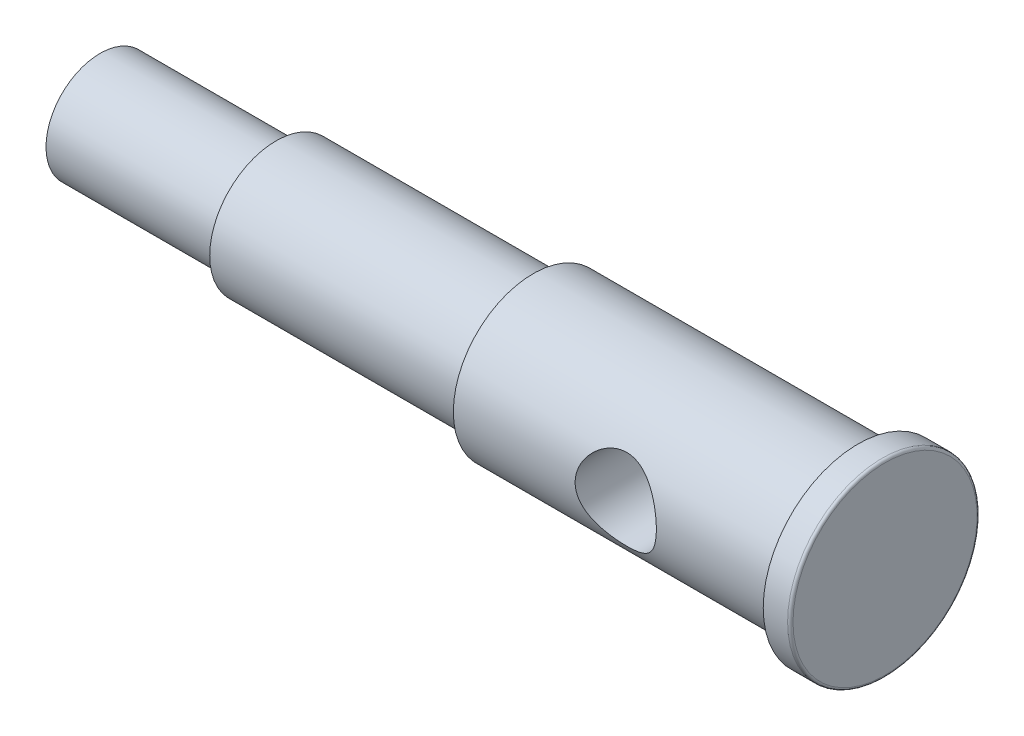
ISO-10303-21;
HEADER;
FILE_DESCRIPTION(('STEP AP214'),'2;1');
FILE_NAME('part.step','',(''),(''),'','','');
FILE_SCHEMA(('AUTOMOTIVE_DESIGN { 1 0 10303 214 1 1 1 1 }'));
ENDSEC;
DATA;
#1=APPLICATION_CONTEXT('core data for automotive mechanical design processes');
#2=APPLICATION_PROTOCOL_DEFINITION('international standard','automotive_design',2000,#1);
#3=PRODUCT_CONTEXT('',#1,'mechanical');
#4=PRODUCT('Part','Part','',(#3));
#5=PRODUCT_RELATED_PRODUCT_CATEGORY('part','',(#4));
#6=PRODUCT_DEFINITION_FORMATION('','',#4);
#7=PRODUCT_DEFINITION_CONTEXT('part definition',#1,'design');
#8=PRODUCT_DEFINITION('design','',#6,#7);
#9=PRODUCT_DEFINITION_SHAPE('','',#8);
#10=(LENGTH_UNIT() NAMED_UNIT(*) SI_UNIT(.MILLI.,.METRE.));
#11=(NAMED_UNIT(*) PLANE_ANGLE_UNIT() SI_UNIT($,.RADIAN.));
#12=(NAMED_UNIT(*) SI_UNIT($,.STERADIAN.) SOLID_ANGLE_UNIT());
#13=UNCERTAINTY_MEASURE_WITH_UNIT(LENGTH_MEASURE(1.E-05),#10,'distance_accuracy_value','');
#14=(GEOMETRIC_REPRESENTATION_CONTEXT(3) GLOBAL_UNCERTAINTY_ASSIGNED_CONTEXT((#13)) GLOBAL_UNIT_ASSIGNED_CONTEXT((#10,
#11,#12)) REPRESENTATION_CONTEXT('',''));
#15=CARTESIAN_POINT('',(0.,0.,0.));
#16=DIRECTION('',(0.,0.,1.));
#17=DIRECTION('',(1.,0.,0.));
#18=AXIS2_PLACEMENT_3D('',#15,#16,#17);
#19=CARTESIAN_POINT('',(-33.9236125358108,0.,0.));
#20=DIRECTION('',(-1.,0.,0.));
#21=DIRECTION('',(0.,0.,1.));
#22=AXIS2_PLACEMENT_3D('',#19,#20,#21);
#23=CYLINDRICAL_SURFACE('',#22,2.95);
#24=CARTESIAN_POINT('',(-5.5,0.,-2.95));
#25=CARTESIAN_POINT('',(-5.50000503871593,-0.07869673435031,-2.94999559444045));
#26=CARTESIAN_POINT('',(-5.50622949979275,-0.157482446479922,-2.94681741484867));
#27=CARTESIAN_POINT('',(-5.53084723153053,-0.312715144182025,-2.93441666615241));
#28=CARTESIAN_POINT('',(-5.54926256217642,-0.389157626702822,-2.92518313988091));
#29=CARTESIAN_POINT('',(-5.59735028528883,-0.537223423951204,-2.90163573698355));
#30=CARTESIAN_POINT('',(-5.62697844408594,-0.608864389643725,-2.88734183722876));
#31=CARTESIAN_POINT('',(-5.69641627464681,-0.746046739389001,-2.85497614699634));
#32=CARTESIAN_POINT('',(-5.73622536650006,-0.811588470566976,-2.8369045717075));
#33=CARTESIAN_POINT('',(-5.82769405407445,-0.939278100980876,-2.79731963304206));
#34=CARTESIAN_POINT('',(-5.87993495264485,-1.00096431002571,-2.77566241584188));
#35=CARTESIAN_POINT('',(-5.99352893326727,-1.11512740958132,-2.73180123324872));
#36=CARTESIAN_POINT('',(-6.05488914504937,-1.16759702363543,-2.70959685150118));
#37=CARTESIAN_POINT('',(-6.19092613962254,-1.26609937555653,-2.66507891365735));
#38=CARTESIAN_POINT('',(-6.26627863375903,-1.31126800314006,-2.64290184026162));
#39=CARTESIAN_POINT('',(-6.42475005487719,-1.38810120588266,-2.6033735872767));
#40=CARTESIAN_POINT('',(-6.50786324675177,-1.41977565835824,-2.58601888111182));
#41=CARTESIAN_POINT('',(-6.67437097246344,-1.46662160804149,-2.5597281341455));
#42=CARTESIAN_POINT('',(-6.75744230069092,-1.48267800645396,-2.5503450854194));
#43=CARTESIAN_POINT('',(-6.92558502284069,-1.50052972313778,-2.53988787731173));
#44=CARTESIAN_POINT('',(-7.0106542204443,-1.50234002835121,-2.53880498616527));
#45=CARTESIAN_POINT('',(-7.16895919051024,-1.49229623961063,-2.54471334665691));
#46=CARTESIAN_POINT('',(-7.2423475085635,-1.48211829616227,-2.55071438482073));
#47=CARTESIAN_POINT('',(-7.38618357384979,-1.45130098512133,-2.56837257787448));
#48=CARTESIAN_POINT('',(-7.45663032026933,-1.43065808791739,-2.5800316410419));
#49=CARTESIAN_POINT('',(-7.59459665133646,-1.37913281800187,-2.60794245242824));
#50=CARTESIAN_POINT('',(-7.66201044268389,-1.34802405139281,-2.62429445325893));
#51=CARTESIAN_POINT('',(-7.7909898122578,-1.27662645182652,-2.65975794379143));
#52=CARTESIAN_POINT('',(-7.85255274365811,-1.23633349184822,-2.67887067263897));
#53=CARTESIAN_POINT('',(-7.9766203858009,-1.14152655141021,-2.720742402698));
#54=CARTESIAN_POINT('',(-8.03818089242887,-1.08583843699796,-2.74365007033312));
#55=CARTESIAN_POINT('',(-8.15149042493197,-0.964854013047627,-2.78849783807758));
#56=CARTESIAN_POINT('',(-8.20323445089531,-0.899552837117744,-2.81043744077174));
#57=CARTESIAN_POINT('',(-8.29786214781391,-0.757110146833941,-2.85220150174812));
#58=CARTESIAN_POINT('',(-8.3401798399505,-0.679542307340964,-2.87186731723045));
#59=CARTESIAN_POINT('',(-8.41081253768916,-0.517136832773197,-2.90549878435036));
#60=CARTESIAN_POINT('',(-8.43913901550867,-0.432305220892479,-2.91946910441195));
#61=CARTESIAN_POINT('',(-8.47859188186329,-0.265479508151909,-2.93912722181314));
#62=CARTESIAN_POINT('',(-8.49097164593932,-0.183853422336868,-2.94541620269777));
#63=CARTESIAN_POINT('',(-8.50213151780586,-0.0194528984196293,-2.95107992232452));
#64=CARTESIAN_POINT('',(-8.50091840307875,0.0633209468424041,-2.95045810682808));
#65=CARTESIAN_POINT('',(-8.48562786154191,0.220552406165059,-2.94271229132657));
#66=CARTESIAN_POINT('',(-8.47259718982846,0.295141803862748,-2.93611742344697));
#67=CARTESIAN_POINT('',(-8.4357041313484,0.440917586201833,-2.91778867207366));
#68=CARTESIAN_POINT('',(-8.41184056831782,0.512103600366814,-2.90605423051633));
#69=CARTESIAN_POINT('',(-8.3533660343892,0.651355432573475,-2.87809368649659));
#70=CARTESIAN_POINT('',(-8.31847453724958,0.71927935020553,-2.8617517068607));
#71=CARTESIAN_POINT('',(-8.23925580265734,0.848526605081854,-2.8261287852623));
#72=CARTESIAN_POINT('',(-8.19492461263943,0.909847161137472,-2.8068466131527));
#73=CARTESIAN_POINT('',(-8.09294087819987,1.03070145821651,-2.7648953424917));
#74=CARTESIAN_POINT('',(-8.03439635478354,1.08943325788574,-2.74208071774784));
#75=CARTESIAN_POINT('',(-7.90827893668872,1.19661414326487,-2.69703569069541));
#76=CARTESIAN_POINT('',(-7.84069932819153,1.2450555123541,-2.67480573769041));
#77=CARTESIAN_POINT('',(-7.693937671066,1.33271643617878,-2.63227429473153));
#78=CARTESIAN_POINT('',(-7.6143306463342,1.3713115576516,-2.6121373394608));
#79=CARTESIAN_POINT('',(-7.44840638649559,1.43414563496893,-2.57818152423995));
#80=CARTESIAN_POINT('',(-7.36209824531948,1.45840367499579,-2.56435427102095));
#81=CARTESIAN_POINT('',(-7.19415215720304,1.48958905707633,-2.5463542377916));
#82=CARTESIAN_POINT('',(-7.11287232720591,1.49796824146672,-2.54137562204879));
#83=CARTESIAN_POINT('',(-6.94995110212914,1.50137389059341,-2.53936711597553));
#84=CARTESIAN_POINT('',(-6.86830990187719,1.49640684001811,-2.54233336538003));
#85=CARTESIAN_POINT('',(-6.71574714813451,1.47462944318993,-2.55501383744185));
#86=CARTESIAN_POINT('',(-6.64457911600263,1.4590734103465,-2.56401198290951));
#87=CARTESIAN_POINT('',(-6.50595388057454,1.41814848099537,-2.58687087210395));
#88=CARTESIAN_POINT('',(-6.43849791441067,1.39277633539327,-2.60073322572287));
#89=CARTESIAN_POINT('',(-6.30420622941838,1.33105008849413,-2.6328863601159));
#90=CARTESIAN_POINT('',(-6.23771373693774,1.29407498770488,-2.6514113135299));
#91=CARTESIAN_POINT('',(-6.11143818769817,1.2108602685606,-2.69043287749404));
#92=CARTESIAN_POINT('',(-6.05165870435389,1.16461575211751,-2.71093052745487));
#93=CARTESIAN_POINT('',(-5.93259071539298,1.05728454884208,-2.75470812521749));
#94=CARTESIAN_POINT('',(-5.87433210590777,0.995058123443852,-2.77801029832032));
#95=CARTESIAN_POINT('',(-5.76883160138958,0.861099921295228,-2.8224073042191));
#96=CARTESIAN_POINT('',(-5.72159590057824,0.789362835449917,-2.84350089226843));
#97=CARTESIAN_POINT('',(-5.63923913580662,0.637104537524569,-2.88146124915088));
#98=CARTESIAN_POINT('',(-5.60425649050883,0.556495686026596,-2.8982791695842));
#99=CARTESIAN_POINT('',(-5.54880657910276,0.389522457326953,-2.92538376116296));
#100=CARTESIAN_POINT('',(-5.52829863224668,0.303174962834285,-2.93568872818504));
#101=CARTESIAN_POINT('',(-5.51039098792342,0.179916071337361,-2.94472774139551));
#102=CARTESIAN_POINT('',(-5.50650029572421,0.144078981771649,-2.94669929185848));
#103=CARTESIAN_POINT('',(-5.5013036115728,0.0721675044238189,-2.94933644897762));
#104=CARTESIAN_POINT('',(-5.49999768906637,0.0360931102920936,-2.95000202054568));
#105=CARTESIAN_POINT('',(-5.5,0.,-2.95));
#106=B_SPLINE_CURVE_WITH_KNOTS('',3,(#24,#25,#26,#27,#28,#29,#30,#31,#32,#33,#34,#35,#36,#37,
#38,#39,#40,#41,#42,#43,#44,#45,#46,#47,#48,#49,#50,#51,#52,#53,#54,#55,#56,#57,#58,#59,#60,#61,
#62,#63,#64,#65,#66,#67,#68,#69,#70,#71,#72,#73,#74,#75,#76,#77,#78,#79,#80,#81,#82,#83,#84,#85,
#86,#87,#88,#89,#90,#91,#92,#93,#94,#95,#96,#97,#98,#99,#100,#101,#102,#103,#104,#105),
.UNSPECIFIED.,.T.,.F.,(4,2,2,2,2,2,2,2,2,2,2,2,2,2,2,2,2,2,2,2,2,2,2,2,2,2,2,2,2,2,2,2,2,2,2,2,
2,2,2,2,4),(0.,0.235943976626285,0.472316076966521,0.707765268088206,0.943201050904171,
1.19322016004746,1.44343577945048,1.7138932280046,1.98415236856085,2.23800942629396,
2.49159938972737,2.71355996079347,2.9355954444026,3.16278092880091,3.39006870353125,
3.64729673840842,3.90465543973482,4.1747645382864,4.44465178933986,4.69168514632822,
4.93859533664129,5.16556655157425,5.39256241753889,5.6258733715497,5.85928220973557,
6.11619843159209,6.37330663577634,6.64403450548799,6.91440119117928,7.15856353823402,
7.40260727278137,7.62186068511772,7.8411867316386,8.0751817156893,8.30930067345639,
8.57320286257479,8.8372529938899,9.10419647639518,9.3703867014721,9.47859606047616,
9.58680832673387),.UNSPECIFIED.);
#107=CARTESIAN_POINT('',(-5.5,0.,-2.95));
#108=VERTEX_POINT('',#107);
#109=EDGE_CURVE('E77',#108,#108,#106,.T.);
#110=ORIENTED_EDGE('',*,*,#109,.F.);
#111=EDGE_LOOP('',(#110));
#112=FACE_BOUND('',#111,.T.);
#113=CARTESIAN_POINT('',(-13.,0.,0.));
#114=DIRECTION('',(-1.,0.,0.));
#115=DIRECTION('',(0.,0.,1.));
#116=AXIS2_PLACEMENT_3D('',#113,#114,#115);
#117=CIRCLE('',#116,2.95);
#118=CARTESIAN_POINT('',(-13.,0.,2.95));
#119=VERTEX_POINT('',#118);
#120=EDGE_CURVE('E55',#119,#119,#117,.T.);
#121=ORIENTED_EDGE('',*,*,#120,.F.);
#122=EDGE_LOOP('',(#121));
#123=FACE_BOUND('',#122,.T.);
#124=CARTESIAN_POINT('',(-1.,0.,0.));
#125=DIRECTION('',(-1.,0.,0.));
#126=DIRECTION('',(0.,0.,1.));
#127=AXIS2_PLACEMENT_3D('',#124,#125,#126);
#128=CIRCLE('',#127,2.95);
#129=CARTESIAN_POINT('',(-1.,0.,2.95));
#130=VERTEX_POINT('',#129);
#131=EDGE_CURVE('E50',#130,#130,#128,.T.);
#132=ORIENTED_EDGE('',*,*,#131,.T.);
#133=EDGE_LOOP('',(#132));
#134=FACE_BOUND('',#133,.T.);
#135=CARTESIAN_POINT('',(-8.5,0.,2.95));
#136=CARTESIAN_POINT('',(-8.49999496128407,0.0786967343503099,2.94999559444045));
#137=CARTESIAN_POINT('',(-8.49377050020725,0.157482446479922,2.94681741484867));
#138=CARTESIAN_POINT('',(-8.46915276846947,0.312715144182025,2.93441666615241));
#139=CARTESIAN_POINT('',(-8.45073743782359,0.389157626702822,2.92518313988091));
#140=CARTESIAN_POINT('',(-8.40264971471117,0.537223423951205,2.90163573698355));
#141=CARTESIAN_POINT('',(-8.37302155591406,0.608864389643726,2.88734183722876));
#142=CARTESIAN_POINT('',(-8.30358372535319,0.746046739389002,2.85497614699634));
#143=CARTESIAN_POINT('',(-8.26377463349994,0.811588470566977,2.8369045717075));
#144=CARTESIAN_POINT('',(-8.17230594592555,0.939278100980876,2.79731963304206));
#145=CARTESIAN_POINT('',(-8.12006504735515,1.00096431002571,2.77566241584188));
#146=CARTESIAN_POINT('',(-8.00647106673273,1.11512740958132,2.73180123324872));
#147=CARTESIAN_POINT('',(-7.94511085495063,1.16759702363543,2.70959685150118));
#148=CARTESIAN_POINT('',(-7.80907386037746,1.26609937555653,2.66507891365735));
#149=CARTESIAN_POINT('',(-7.73372136624097,1.31126800314006,2.64290184026162));
#150=CARTESIAN_POINT('',(-7.57524994512281,1.38810120588266,2.6033735872767));
#151=CARTESIAN_POINT('',(-7.49213675324823,1.41977565835824,2.58601888111182));
#152=CARTESIAN_POINT('',(-7.32562902753657,1.46662160804149,2.5597281341455));
#153=CARTESIAN_POINT('',(-7.24255769930908,1.48267800645396,2.5503450854194));
#154=CARTESIAN_POINT('',(-7.07441497715931,1.50052972313778,2.53988787731173));
#155=CARTESIAN_POINT('',(-6.9893457795557,1.50234002835121,2.53880498616527));
#156=CARTESIAN_POINT('',(-6.83104080948976,1.49229623961063,2.54471334665691));
#157=CARTESIAN_POINT('',(-6.7576524914365,1.48211829616227,2.55071438482073));
#158=CARTESIAN_POINT('',(-6.61381642615021,1.45130098512133,2.56837257787448));
#159=CARTESIAN_POINT('',(-6.54336967973068,1.43065808791739,2.58003164104189));
#160=CARTESIAN_POINT('',(-6.40540334866355,1.37913281800187,2.60794245242824));
#161=CARTESIAN_POINT('',(-6.33798955731611,1.34802405139281,2.62429445325893));
#162=CARTESIAN_POINT('',(-6.2090101877422,1.27662645182652,2.65975794379143));
#163=CARTESIAN_POINT('',(-6.1474472563419,1.23633349184822,2.67887067263897));
#164=CARTESIAN_POINT('',(-6.0233796141991,1.14152655141021,2.720742402698));
#165=CARTESIAN_POINT('',(-5.96181910757113,1.08583843699796,2.74365007033312));
#166=CARTESIAN_POINT('',(-5.84850957506804,0.964854013047626,2.78849783807758));
#167=CARTESIAN_POINT('',(-5.79676554910469,0.899552837117743,2.81043744077174));
#168=CARTESIAN_POINT('',(-5.70213785218609,0.757110146833941,2.85220150174812));
#169=CARTESIAN_POINT('',(-5.6598201600495,0.679542307340965,2.87186731723045));
#170=CARTESIAN_POINT('',(-5.58918746231084,0.517136832773199,2.90549878435036));
#171=CARTESIAN_POINT('',(-5.56086098449133,0.432305220892481,2.91946910441195));
#172=CARTESIAN_POINT('',(-5.52140811813671,0.26547950815191,2.93912722181314));
#173=CARTESIAN_POINT('',(-5.50902835406068,0.183853422336868,2.94541620269777));
#174=CARTESIAN_POINT('',(-5.49786848219414,0.0194528984196298,2.95107992232452));
#175=CARTESIAN_POINT('',(-5.49908159692125,-0.0633209468424038,2.95045810682808));
#176=CARTESIAN_POINT('',(-5.51437213845809,-0.22055240616506,2.94271229132657));
#177=CARTESIAN_POINT('',(-5.52740281017155,-0.295141803862748,2.93611742344697));
#178=CARTESIAN_POINT('',(-5.5642958686516,-0.440917586201833,2.91778867207366));
#179=CARTESIAN_POINT('',(-5.58815943168218,-0.512103600366814,2.90605423051633));
#180=CARTESIAN_POINT('',(-5.6466339656108,-0.651355432573475,2.87809368649659));
#181=CARTESIAN_POINT('',(-5.68152546275042,-0.719279350205531,2.8617517068607));
#182=CARTESIAN_POINT('',(-5.76074419734266,-0.848526605081855,2.8261287852623));
#183=CARTESIAN_POINT('',(-5.80507538736057,-0.909847161137473,2.8068466131527));
#184=CARTESIAN_POINT('',(-5.90705912180014,-1.03070145821651,2.7648953424917));
#185=CARTESIAN_POINT('',(-5.96560364521646,-1.08943325788574,2.74208071774784));
#186=CARTESIAN_POINT('',(-6.09172106331129,-1.19661414326487,2.69703569069541));
#187=CARTESIAN_POINT('',(-6.15930067180847,-1.2450555123541,2.67480573769041));
#188=CARTESIAN_POINT('',(-6.30606232893401,-1.33271643617878,2.63227429473153));
#189=CARTESIAN_POINT('',(-6.3856693536658,-1.3713115576516,2.6121373394608));
#190=CARTESIAN_POINT('',(-6.55159361350441,-1.43414563496893,2.57818152423995));
#191=CARTESIAN_POINT('',(-6.63790175468052,-1.45840367499579,2.56435427102095));
#192=CARTESIAN_POINT('',(-6.80584784279696,-1.48958905707633,2.5463542377916));
#193=CARTESIAN_POINT('',(-6.88712767279409,-1.49796824146672,2.54137562204879));
#194=CARTESIAN_POINT('',(-7.05004889787086,-1.50137389059341,2.53936711597553));
#195=CARTESIAN_POINT('',(-7.13169009812281,-1.49640684001811,2.54233336538003));
#196=CARTESIAN_POINT('',(-7.28425285186549,-1.47462944318993,2.55501383744185));
#197=CARTESIAN_POINT('',(-7.35542088399737,-1.4590734103465,2.56401198290951));
#198=CARTESIAN_POINT('',(-7.49404611942546,-1.41814848099537,2.58687087210395));
#199=CARTESIAN_POINT('',(-7.56150208558933,-1.39277633539327,2.60073322572287));
#200=CARTESIAN_POINT('',(-7.69579377058162,-1.33105008849413,2.6328863601159));
#201=CARTESIAN_POINT('',(-7.76228626306226,-1.29407498770488,2.6514113135299));
#202=CARTESIAN_POINT('',(-7.88856181230183,-1.2108602685606,2.69043287749404));
#203=CARTESIAN_POINT('',(-7.94834129564611,-1.16461575211751,2.71093052745487));
#204=CARTESIAN_POINT('',(-8.06740928460703,-1.05728454884209,2.75470812521749));
#205=CARTESIAN_POINT('',(-8.12566789409223,-0.995058123443852,2.77801029832032));
#206=CARTESIAN_POINT('',(-8.23116839861042,-0.861099921295227,2.8224073042191));
#207=CARTESIAN_POINT('',(-8.27840409942176,-0.789362835449915,2.84350089226843));
#208=CARTESIAN_POINT('',(-8.36076086419338,-0.637104537524568,2.88146124915088));
#209=CARTESIAN_POINT('',(-8.39574350949117,-0.556495686026596,2.8982791695842));
#210=CARTESIAN_POINT('',(-8.45119342089724,-0.389522457326954,2.92538376116296));
#211=CARTESIAN_POINT('',(-8.47170136775332,-0.303174962834286,2.93568872818504));
#212=CARTESIAN_POINT('',(-8.48960901207659,-0.179916071337363,2.94472774139551));
#213=CARTESIAN_POINT('',(-8.4934997042758,-0.144078981771651,2.94669929185848));
#214=CARTESIAN_POINT('',(-8.49869638842721,-0.07216750442382,2.94933644897762));
#215=CARTESIAN_POINT('',(-8.50000231093363,-0.0360931102920941,2.95000202054568));
#216=CARTESIAN_POINT('',(-8.5,0.,2.95));
#217=B_SPLINE_CURVE_WITH_KNOTS('',3,(#135,#136,#137,#138,#139,#140,#141,#142,#143,#144,#145,
#146,#147,#148,#149,#150,#151,#152,#153,#154,#155,#156,#157,#158,#159,#160,#161,#162,#163,#164,
#165,#166,#167,#168,#169,#170,#171,#172,#173,#174,#175,#176,#177,#178,#179,#180,#181,#182,#183,
#184,#185,#186,#187,#188,#189,#190,#191,#192,#193,#194,#195,#196,#197,#198,#199,#200,#201,#202,
#203,#204,#205,#206,#207,#208,#209,#210,#211,#212,#213,#214,#215,#216),.UNSPECIFIED.,.T.,.F.,(4,
2,2,2,2,2,2,2,2,2,2,2,2,2,2,2,2,2,2,2,2,2,2,2,2,2,2,2,2,2,2,2,2,2,2,2,2,2,2,2,4),(0.,
0.235943976626285,0.472316076966521,0.707765268088208,0.943201050904171,1.19322016004746,
1.44343577945048,1.7138932280046,1.98415236856085,2.23800942629396,2.49159938972737,
2.71355996079346,2.9355954444026,3.16278092880091,3.39006870353125,3.64729673840842,
3.90465543973482,4.1747645382864,4.44465178933986,4.69168514632822,4.93859533664129,
5.16556655157424,5.39256241753889,5.6258733715497,5.85928220973557,6.11619843159209,
6.37330663577634,6.64403450548799,6.91440119117928,7.15856353823402,7.40260727278136,
7.62186068511772,7.8411867316386,8.0751817156893,8.30930067345638,8.57320286257479,
8.8372529938899,9.10419647639518,9.3703867014721,9.47859606047617,9.58680832673387),.UNSPECIFIED.);
#218=CARTESIAN_POINT('',(-8.5,0.,2.95));
#219=VERTEX_POINT('',#218);
#220=EDGE_CURVE('E70',#219,#219,#217,.T.);
#221=ORIENTED_EDGE('',*,*,#220,.T.);
#222=EDGE_LOOP('',(#221));
#223=FACE_BOUND('',#222,.T.);
#224=ADVANCED_FACE('F35',(#112,#123,#134,#223),#23,.T.);
#225=CARTESIAN_POINT('',(-29.,0.,-2.));
#226=DIRECTION('',(1.,0.,0.));
#227=DIRECTION('',(0.,0.,-1.));
#228=AXIS2_PLACEMENT_3D('',#225,#226,#227);
#229=PLANE('',#228);
#230=CARTESIAN_POINT('',(-29.,0.,0.));
#231=DIRECTION('',(-1.,0.,0.));
#232=DIRECTION('',(0.,0.,1.));
#233=AXIS2_PLACEMENT_3D('',#230,#231,#232);
#234=CIRCLE('',#233,2.);
#235=CARTESIAN_POINT('',(-29.,0.,2.));
#236=VERTEX_POINT('',#235);
#237=EDGE_CURVE('E67',#236,#236,#234,.T.);
#238=ORIENTED_EDGE('',*,*,#237,.T.);
#239=EDGE_LOOP('',(#238));
#240=FACE_BOUND('',#239,.T.);
#241=ADVANCED_FACE('F109',(#240),#229,.F.);
#242=CARTESIAN_POINT('',(0.,0.,0.));
#243=DIRECTION('',(-1.,0.,0.));
#244=DIRECTION('',(0.,0.,1.));
#245=AXIS2_PLACEMENT_3D('',#242,#243,#244);
#246=PLANE('',#245);
#247=CARTESIAN_POINT('',(0.,0.,0.));
#248=DIRECTION('',(-1.,0.,0.));
#249=DIRECTION('',(0.,0.,1.));
#250=AXIS2_PLACEMENT_3D('',#247,#248,#249);
#251=CIRCLE('',#250,3.4);
#252=CARTESIAN_POINT('',(0.,0.,3.4));
#253=VERTEX_POINT('',#252);
#254=EDGE_CURVE('E10',#253,#253,#251,.F.);
#255=ORIENTED_EDGE('',*,*,#254,.T.);
#256=EDGE_LOOP('',(#255));
#257=FACE_BOUND('',#256,.T.);
#258=ADVANCED_FACE('F117',(#257),#246,.F.);
#259=CARTESIAN_POINT('',(-33.9236125358108,0.,0.));
#260=DIRECTION('',(-1.,0.,0.));
#261=DIRECTION('',(0.,0.,1.));
#262=AXIS2_PLACEMENT_3D('',#259,#260,#261);
#263=CYLINDRICAL_SURFACE('',#262,3.5);
#264=CARTESIAN_POINT('',(-0.100000000000003,0.,0.));
#265=DIRECTION('',(-1.,0.,0.));
#266=DIRECTION('',(0.,0.,1.));
#267=AXIS2_PLACEMENT_3D('',#264,#265,#266);
#268=CIRCLE('',#267,3.5);
#269=CARTESIAN_POINT('',(-0.100000000000003,0.,3.5));
#270=VERTEX_POINT('',#269);
#271=EDGE_CURVE('E42',#270,#270,#268,.T.);
#272=ORIENTED_EDGE('',*,*,#271,.T.);
#273=EDGE_LOOP('',(#272));
#274=FACE_BOUND('',#273,.T.);
#275=CARTESIAN_POINT('',(-1.,0.,0.));
#276=DIRECTION('',(-1.,0.,0.));
#277=DIRECTION('',(0.,0.,1.));
#278=AXIS2_PLACEMENT_3D('',#275,#276,#277);
#279=CIRCLE('',#278,3.5);
#280=CARTESIAN_POINT('',(-1.,0.,3.5));
#281=VERTEX_POINT('',#280);
#282=EDGE_CURVE('E46',#281,#281,#279,.T.);
#283=ORIENTED_EDGE('',*,*,#282,.F.);
#284=EDGE_LOOP('',(#283));
#285=FACE_BOUND('',#284,.T.);
#286=ADVANCED_FACE('F113',(#274,#285),#263,.T.);
#287=CARTESIAN_POINT('',(-1.,0.,-3.5));
#288=DIRECTION('',(1.,0.,0.));
#289=DIRECTION('',(0.,0.,-1.));
#290=AXIS2_PLACEMENT_3D('',#287,#288,#289);
#291=PLANE('',#290);
#292=ORIENTED_EDGE('',*,*,#131,.F.);
#293=EDGE_LOOP('',(#292));
#294=FACE_BOUND('',#293,.T.);
#295=ORIENTED_EDGE('',*,*,#282,.T.);
#296=EDGE_LOOP('',(#295));
#297=FACE_BOUND('',#296,.T.);
#298=ADVANCED_FACE('F105',(#294,#297),#291,.F.);
#299=CARTESIAN_POINT('',(-13.,0.,-2.95));
#300=DIRECTION('',(1.,0.,0.));
#301=DIRECTION('',(0.,0.,-1.));
#302=AXIS2_PLACEMENT_3D('',#299,#300,#301);
#303=PLANE('',#302);
#304=CARTESIAN_POINT('',(-13.,0.,0.));
#305=DIRECTION('',(-1.,0.,0.));
#306=DIRECTION('',(0.,0.,1.));
#307=AXIS2_PLACEMENT_3D('',#304,#305,#306);
#308=CIRCLE('',#307,2.45);
#309=CARTESIAN_POINT('',(-13.,0.,2.45));
#310=VERTEX_POINT('',#309);
#311=EDGE_CURVE('E58',#310,#310,#308,.T.);
#312=ORIENTED_EDGE('',*,*,#311,.F.);
#313=EDGE_LOOP('',(#312));
#314=FACE_BOUND('',#313,.T.);
#315=ORIENTED_EDGE('',*,*,#120,.T.);
#316=EDGE_LOOP('',(#315));
#317=FACE_BOUND('',#316,.T.);
#318=ADVANCED_FACE('F101',(#314,#317),#303,.F.);
#319=CARTESIAN_POINT('',(-33.9236125358108,0.,0.));
#320=DIRECTION('',(-1.,0.,0.));
#321=DIRECTION('',(0.,0.,1.));
#322=AXIS2_PLACEMENT_3D('',#319,#320,#321);
#323=CYLINDRICAL_SURFACE('',#322,2.45);
#324=CARTESIAN_POINT('',(-22.5,0.,0.));
#325=DIRECTION('',(-1.,0.,0.));
#326=DIRECTION('',(0.,0.,1.));
#327=AXIS2_PLACEMENT_3D('',#324,#325,#326);
#328=CIRCLE('',#327,2.45);
#329=CARTESIAN_POINT('',(-22.5,0.,2.45));
#330=VERTEX_POINT('',#329);
#331=EDGE_CURVE('E61',#330,#330,#328,.T.);
#332=ORIENTED_EDGE('',*,*,#331,.F.);
#333=EDGE_LOOP('',(#332));
#334=FACE_BOUND('',#333,.T.);
#335=ORIENTED_EDGE('',*,*,#311,.T.);
#336=EDGE_LOOP('',(#335));
#337=FACE_BOUND('',#336,.T.);
#338=ADVANCED_FACE('F97',(#334,#337),#323,.T.);
#339=CARTESIAN_POINT('',(-22.5,0.,-2.45));
#340=DIRECTION('',(1.,0.,0.));
#341=DIRECTION('',(0.,0.,-1.));
#342=AXIS2_PLACEMENT_3D('',#339,#340,#341);
#343=PLANE('',#342);
#344=CARTESIAN_POINT('',(-22.5,0.,0.));
#345=DIRECTION('',(-1.,0.,0.));
#346=DIRECTION('',(0.,0.,1.));
#347=AXIS2_PLACEMENT_3D('',#344,#345,#346);
#348=CIRCLE('',#347,2.);
#349=CARTESIAN_POINT('',(-22.5,0.,2.));
#350=VERTEX_POINT('',#349);
#351=EDGE_CURVE('E64',#350,#350,#348,.T.);
#352=ORIENTED_EDGE('',*,*,#351,.F.);
#353=EDGE_LOOP('',(#352));
#354=FACE_BOUND('',#353,.T.);
#355=ORIENTED_EDGE('',*,*,#331,.T.);
#356=EDGE_LOOP('',(#355));
#357=FACE_BOUND('',#356,.T.);
#358=ADVANCED_FACE('F93',(#354,#357),#343,.F.);
#359=CARTESIAN_POINT('',(-33.9236125358108,0.,0.));
#360=DIRECTION('',(-1.,0.,0.));
#361=DIRECTION('',(0.,0.,1.));
#362=AXIS2_PLACEMENT_3D('',#359,#360,#361);
#363=CYLINDRICAL_SURFACE('',#362,2.);
#364=ORIENTED_EDGE('',*,*,#237,.F.);
#365=EDGE_LOOP('',(#364));
#366=FACE_BOUND('',#365,.T.);
#367=ORIENTED_EDGE('',*,*,#351,.T.);
#368=EDGE_LOOP('',(#367));
#369=FACE_BOUND('',#368,.T.);
#370=ADVANCED_FACE('F89',(#366,#369),#363,.T.);
#371=CARTESIAN_POINT('',(-7.,0.,3.501));
#372=DIRECTION('',(0.,0.,-1.));
#373=DIRECTION('',(-1.,0.,0.));
#374=AXIS2_PLACEMENT_3D('',#371,#372,#373);
#375=CYLINDRICAL_SURFACE('',#374,1.5);
#376=ORIENTED_EDGE('',*,*,#220,.F.);
#377=EDGE_LOOP('',(#376));
#378=FACE_BOUND('',#377,.T.);
#379=ORIENTED_EDGE('',*,*,#109,.T.);
#380=EDGE_LOOP('',(#379));
#381=FACE_BOUND('',#380,.T.);
#382=ADVANCED_FACE('F82',(#378,#381),#375,.F.);
#383=CARTESIAN_POINT('',(-0.100000000000003,0.,0.));
#384=DIRECTION('',(-1.,0.,0.));
#385=DIRECTION('',(0.,0.,1.));
#386=AXIS2_PLACEMENT_3D('',#383,#384,#385);
#387=TOROIDAL_SURFACE('',#386,3.4,0.1);
#388=ORIENTED_EDGE('',*,*,#254,.F.);
#389=EDGE_LOOP('',(#388));
#390=FACE_BOUND('',#389,.T.);
#391=ORIENTED_EDGE('',*,*,#271,.F.);
#392=EDGE_LOOP('',(#391));
#393=FACE_BOUND('',#392,.T.);
#394=ADVANCED_FACE('F37',(#390,#393),#387,.T.);
#395=CLOSED_SHELL('',(#224,#241,#258,#286,#298,#318,#338,#358,#370,#382,#394));
#396=MANIFOLD_SOLID_BREP('B2',#395);
#397=ADVANCED_BREP_SHAPE_REPRESENTATION('',(#18,#396),#14);
#398=SHAPE_DEFINITION_REPRESENTATION(#9,#397);
ENDSEC;
END-ISO-10303-21;
